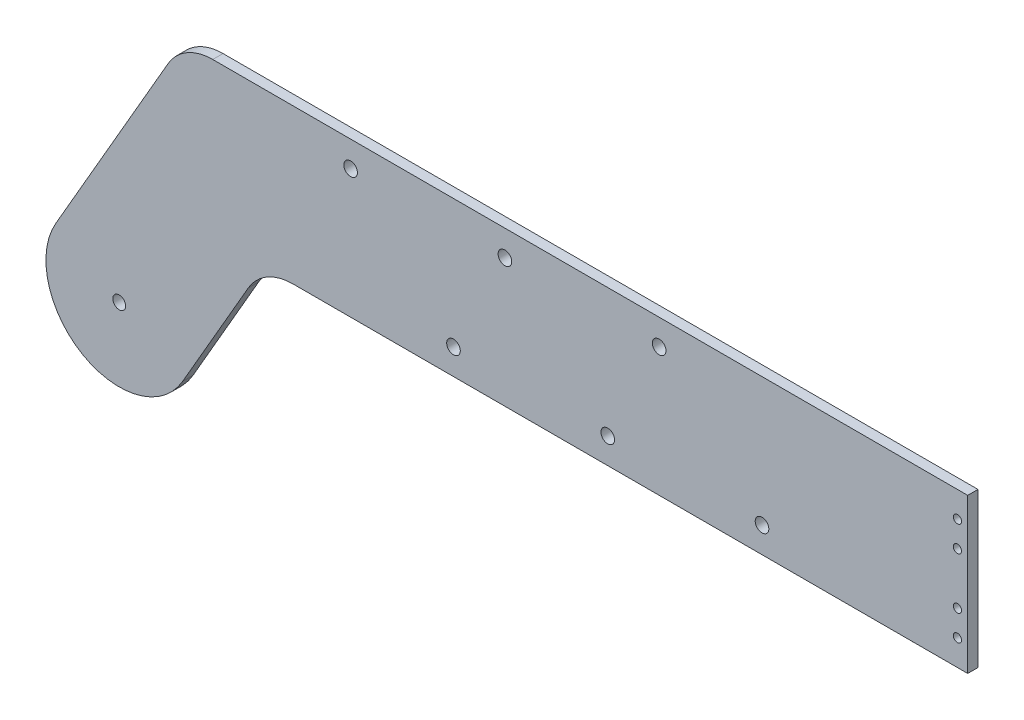
ISO-10303-21;
HEADER;
FILE_DESCRIPTION(('STEP AP214'),'2;1');
FILE_NAME('part.step','',(''),(''),'','','');
FILE_SCHEMA(('AUTOMOTIVE_DESIGN { 1 0 10303 214 1 1 1 1 }'));
ENDSEC;
DATA;
#1=APPLICATION_CONTEXT('core data for automotive mechanical design processes');
#2=APPLICATION_PROTOCOL_DEFINITION('international standard','automotive_design',2000,#1);
#3=PRODUCT_CONTEXT('',#1,'mechanical');
#4=PRODUCT('Part','Part','',(#3));
#5=PRODUCT_RELATED_PRODUCT_CATEGORY('part','',(#4));
#6=PRODUCT_DEFINITION_FORMATION('','',#4);
#7=PRODUCT_DEFINITION_CONTEXT('part definition',#1,'design');
#8=PRODUCT_DEFINITION('design','',#6,#7);
#9=PRODUCT_DEFINITION_SHAPE('','',#8);
#10=(LENGTH_UNIT() NAMED_UNIT(*) SI_UNIT(.MILLI.,.METRE.));
#11=(NAMED_UNIT(*) PLANE_ANGLE_UNIT() SI_UNIT($,.RADIAN.));
#12=(NAMED_UNIT(*) SI_UNIT($,.STERADIAN.) SOLID_ANGLE_UNIT());
#13=UNCERTAINTY_MEASURE_WITH_UNIT(LENGTH_MEASURE(1.E-05),#10,'distance_accuracy_value','');
#14=(GEOMETRIC_REPRESENTATION_CONTEXT(3) GLOBAL_UNCERTAINTY_ASSIGNED_CONTEXT((#13)) GLOBAL_UNIT_ASSIGNED_CONTEXT((#10,
#11,#12)) REPRESENTATION_CONTEXT('',''));
#15=CARTESIAN_POINT('',(0.,0.,0.));
#16=DIRECTION('',(0.,0.,1.));
#17=DIRECTION('',(1.,0.,0.));
#18=AXIS2_PLACEMENT_3D('',#15,#16,#17);
#19=CARTESIAN_POINT('',(150.75,35.75,4.));
#20=DIRECTION('',(0.,0.,1.));
#21=DIRECTION('',(1.,0.,0.));
#22=AXIS2_PLACEMENT_3D('',#19,#20,#21);
#23=PLANE('',#22);
#24=CARTESIAN_POINT('',(0.,0.,4.));
#25=DIRECTION('',(0.,0.,-1.));
#26=DIRECTION('',(1.,0.,0.));
#27=AXIS2_PLACEMENT_3D('',#24,#25,#26);
#28=CIRCLE('',#27,2.5);
#29=CARTESIAN_POINT('',(-2.5,0.,4.));
#30=VERTEX_POINT('',#29);
#31=EDGE_CURVE('E384',#30,#30,#28,.T.);
#32=ORIENTED_EDGE('',*,*,#31,.T.);
#33=EDGE_LOOP('',(#32));
#34=FACE_BOUND('',#33,.T.);
#35=CARTESIAN_POINT('',(326.,50.,4.));
#36=DIRECTION('',(0.,0.,-1.));
#37=DIRECTION('',(1.,0.,0.));
#38=AXIS2_PLACEMENT_3D('',#35,#36,#37);
#39=CIRCLE('',#38,1.6);
#40=CARTESIAN_POINT('',(324.4,50.,4.));
#41=VERTEX_POINT('',#40);
#42=EDGE_CURVE('E314',#41,#41,#39,.T.);
#43=ORIENTED_EDGE('',*,*,#42,.T.);
#44=EDGE_LOOP('',(#43));
#45=FACE_BOUND('',#44,.T.);
#46=CARTESIAN_POINT('',(326.,60.,4.));
#47=DIRECTION('',(0.,0.,-1.));
#48=DIRECTION('',(1.,0.,0.));
#49=AXIS2_PLACEMENT_3D('',#46,#47,#48);
#50=CIRCLE('',#49,1.6);
#51=CARTESIAN_POINT('',(324.4,60.,4.));
#52=VERTEX_POINT('',#51);
#53=EDGE_CURVE('E210',#52,#52,#50,.T.);
#54=ORIENTED_EDGE('',*,*,#53,.T.);
#55=EDGE_LOOP('',(#54));
#56=FACE_BOUND('',#55,.T.);
#57=CARTESIAN_POINT('',(326.,80.,4.));
#58=DIRECTION('',(0.,0.,-1.));
#59=DIRECTION('',(1.,0.,0.));
#60=AXIS2_PLACEMENT_3D('',#57,#58,#59);
#61=CIRCLE('',#60,1.6);
#62=CARTESIAN_POINT('',(324.4,80.,4.));
#63=VERTEX_POINT('',#62);
#64=EDGE_CURVE('E297',#63,#63,#61,.T.);
#65=ORIENTED_EDGE('',*,*,#64,.T.);
#66=EDGE_LOOP('',(#65));
#67=FACE_BOUND('',#66,.T.);
#68=CARTESIAN_POINT('',(326.,90.,4.));
#69=DIRECTION('',(0.,0.,-1.));
#70=DIRECTION('',(1.,0.,0.));
#71=AXIS2_PLACEMENT_3D('',#68,#69,#70);
#72=CIRCLE('',#71,1.6);
#73=CARTESIAN_POINT('',(324.4,90.,4.));
#74=VERTEX_POINT('',#73);
#75=EDGE_CURVE('E286',#74,#74,#72,.T.);
#76=ORIENTED_EDGE('',*,*,#75,.T.);
#77=EDGE_LOOP('',(#76));
#78=FACE_BOUND('',#77,.T.);
#79=CARTESIAN_POINT('',(210.,90.,4.));
#80=DIRECTION('',(0.,0.,-1.));
#81=DIRECTION('',(1.,0.,0.));
#82=AXIS2_PLACEMENT_3D('',#79,#80,#81);
#83=CIRCLE('',#82,2.65);
#84=CARTESIAN_POINT('',(207.35,90.,4.));
#85=VERTEX_POINT('',#84);
#86=EDGE_CURVE('E225',#85,#85,#83,.T.);
#87=ORIENTED_EDGE('',*,*,#86,.T.);
#88=EDGE_LOOP('',(#87));
#89=FACE_BOUND('',#88,.T.);
#90=CARTESIAN_POINT('',(250.,50.,4.));
#91=DIRECTION('',(0.,0.,-1.));
#92=DIRECTION('',(1.,0.,0.));
#93=AXIS2_PLACEMENT_3D('',#90,#91,#92);
#94=CIRCLE('',#93,2.65);
#95=CARTESIAN_POINT('',(247.35,50.,4.));
#96=VERTEX_POINT('',#95);
#97=EDGE_CURVE('E257',#96,#96,#94,.T.);
#98=ORIENTED_EDGE('',*,*,#97,.T.);
#99=EDGE_LOOP('',(#98));
#100=FACE_BOUND('',#99,.T.);
#101=CARTESIAN_POINT('',(150.,90.,4.));
#102=DIRECTION('',(0.,0.,-1.));
#103=DIRECTION('',(1.,0.,0.));
#104=AXIS2_PLACEMENT_3D('',#101,#102,#103);
#105=CIRCLE('',#104,2.65);
#106=CARTESIAN_POINT('',(147.35,90.,4.));
#107=VERTEX_POINT('',#106);
#108=EDGE_CURVE('E241',#107,#107,#105,.T.);
#109=ORIENTED_EDGE('',*,*,#108,.T.);
#110=EDGE_LOOP('',(#109));
#111=FACE_BOUND('',#110,.T.);
#112=CARTESIAN_POINT('',(190.,50.,4.));
#113=DIRECTION('',(0.,0.,-1.));
#114=DIRECTION('',(1.,0.,0.));
#115=AXIS2_PLACEMENT_3D('',#112,#113,#114);
#116=CIRCLE('',#115,2.65);
#117=CARTESIAN_POINT('',(187.35,50.,4.));
#118=VERTEX_POINT('',#117);
#119=EDGE_CURVE('E224',#118,#118,#116,.T.);
#120=ORIENTED_EDGE('',*,*,#119,.T.);
#121=EDGE_LOOP('',(#120));
#122=FACE_BOUND('',#121,.T.);
#123=CARTESIAN_POINT('',(90.,90.,4.));
#124=DIRECTION('',(0.,0.,-1.));
#125=DIRECTION('',(1.,0.,0.));
#126=AXIS2_PLACEMENT_3D('',#123,#124,#125);
#127=CIRCLE('',#126,2.65);
#128=CARTESIAN_POINT('',(87.35,90.,4.));
#129=VERTEX_POINT('',#128);
#130=EDGE_CURVE('E214',#129,#129,#127,.T.);
#131=ORIENTED_EDGE('',*,*,#130,.T.);
#132=EDGE_LOOP('',(#131));
#133=FACE_BOUND('',#132,.T.);
#134=CARTESIAN_POINT('',(130.,50.,4.));
#135=DIRECTION('',(0.,0.,-1.));
#136=DIRECTION('',(1.,0.,0.));
#137=AXIS2_PLACEMENT_3D('',#134,#135,#136);
#138=CIRCLE('',#137,2.65);
#139=CARTESIAN_POINT('',(127.35,50.,4.));
#140=VERTEX_POINT('',#139);
#141=EDGE_CURVE('E193',#140,#140,#138,.T.);
#142=ORIENTED_EDGE('',*,*,#141,.T.);
#143=EDGE_LOOP('',(#142));
#144=FACE_BOUND('',#143,.T.);
#145=CARTESIAN_POINT('',(36.3730669589464,80.,4.));
#146=DIRECTION('',(0.,0.,-1.));
#147=DIRECTION('',(-0.5,0.866025403784439,0.));
#148=AXIS2_PLACEMENT_3D('',#145,#146,#147);
#149=CIRCLE('',#148,20.);
#150=CARTESIAN_POINT('',(19.0525588832576,90.,4.));
#151=VERTEX_POINT('',#150);
#152=CARTESIAN_POINT('',(36.3730669589464,100.,4.));
#153=VERTEX_POINT('',#152);
#154=EDGE_CURVE('E269',#151,#153,#149,.T.);
#155=ORIENTED_EDGE('',*,*,#154,.F.);
#156=DIRECTION('',(-0.5,-0.866025403784439,0.));
#157=VECTOR('',#156,1.);
#158=CARTESIAN_POINT('',(24.8260615751539,100.,4.));
#159=LINE('',#158,#157);
#160=CARTESIAN_POINT('',(-24.6817240078565,14.25,4.));
#161=VERTEX_POINT('',#160);
#162=EDGE_CURVE('E25',#151,#161,#159,.T.);
#163=ORIENTED_EDGE('',*,*,#162,.T.);
#164=CARTESIAN_POINT('',(0.,0.,4.));
#165=DIRECTION('',(0.,0.,1.));
#166=DIRECTION('',(1.,0.,0.));
#167=AXIS2_PLACEMENT_3D('',#164,#165,#166);
#168=CIRCLE('',#167,28.5);
#169=CARTESIAN_POINT('',(24.6817240078565,-14.25,4.));
#170=VERTEX_POINT('',#169);
#171=EDGE_CURVE('E43',#161,#170,#168,.T.);
#172=ORIENTED_EDGE('',*,*,#171,.T.);
#173=DIRECTION('',(0.5,0.866025403784439,0.));
#174=VECTOR('',#173,1.);
#175=CARTESIAN_POINT('',(24.6817240078565,-14.25,4.));
#176=LINE('',#175,#174);
#177=CARTESIAN_POINT('',(50.2294734194974,30.,4.));
#178=VERTEX_POINT('',#177);
#179=EDGE_CURVE('E277',#170,#178,#176,.T.);
#180=ORIENTED_EDGE('',*,*,#179,.T.);
#181=CARTESIAN_POINT('',(67.5499814951862,20.,4.));
#182=DIRECTION('',(0.,0.,1.));
#183=DIRECTION('',(-0.5,0.866025403784438,0.));
#184=AXIS2_PLACEMENT_3D('',#181,#182,#183);
#185=CIRCLE('',#184,20.);
#186=CARTESIAN_POINT('',(67.5499814951862,40.,4.));
#187=VERTEX_POINT('',#186);
#188=EDGE_CURVE('E333',#187,#178,#185,.T.);
#189=ORIENTED_EDGE('',*,*,#188,.F.);
#190=DIRECTION('',(1.,0.,0.));
#191=VECTOR('',#190,1.);
#192=CARTESIAN_POINT('',(56.0029761113936,40.,4.));
#193=LINE('',#192,#191);
#194=CARTESIAN_POINT('',(330.,40.,4.));
#195=VERTEX_POINT('',#194);
#196=EDGE_CURVE('E265',#187,#195,#193,.T.);
#197=ORIENTED_EDGE('',*,*,#196,.T.);
#198=DIRECTION('',(0.,1.,0.));
#199=VECTOR('',#198,1.);
#200=CARTESIAN_POINT('',(330.,40.,4.));
#201=LINE('',#200,#199);
#202=CARTESIAN_POINT('',(330.,100.,4.));
#203=VERTEX_POINT('',#202);
#204=EDGE_CURVE('E11',#195,#203,#201,.T.);
#205=ORIENTED_EDGE('',*,*,#204,.T.);
#206=DIRECTION('',(-1.,0.,0.));
#207=VECTOR('',#206,1.);
#208=CARTESIAN_POINT('',(330.,100.,4.));
#209=LINE('',#208,#207);
#210=EDGE_CURVE('E362',#203,#153,#209,.T.);
#211=ORIENTED_EDGE('',*,*,#210,.T.);
#212=EDGE_LOOP('',(#155,#163,#172,#180,#189,#197,#205,#211));
#213=FACE_BOUND('',#212,.T.);
#214=ADVANCED_FACE('F17',(#34,#45,#56,#67,#78,#89,#100,#111,#122,#133,#144,#213),#23,.T.);
#215=CARTESIAN_POINT('',(330.,40.,0.));
#216=DIRECTION('',(1.,0.,0.));
#217=DIRECTION('',(0.,1.,0.));
#218=AXIS2_PLACEMENT_3D('',#215,#216,#217);
#219=PLANE('',#218);
#220=DIRECTION('',(0.,1.,0.));
#221=VECTOR('',#220,1.);
#222=CARTESIAN_POINT('',(330.,40.,0.));
#223=LINE('',#222,#221);
#224=CARTESIAN_POINT('',(330.,40.,0.));
#225=VERTEX_POINT('',#224);
#226=CARTESIAN_POINT('',(330.,100.,0.));
#227=VERTEX_POINT('',#226);
#228=EDGE_CURVE('E298',#225,#227,#223,.T.);
#229=ORIENTED_EDGE('',*,*,#228,.T.);
#230=DIRECTION('',(0.,0.,1.));
#231=VECTOR('',#230,1.);
#232=CARTESIAN_POINT('',(330.,100.,0.));
#233=LINE('',#232,#231);
#234=EDGE_CURVE('E380',#227,#203,#233,.T.);
#235=ORIENTED_EDGE('',*,*,#234,.T.);
#236=ORIENTED_EDGE('',*,*,#204,.F.);
#237=DIRECTION('',(0.,0.,1.));
#238=VECTOR('',#237,1.);
#239=CARTESIAN_POINT('',(330.,40.,0.));
#240=LINE('',#239,#238);
#241=EDGE_CURVE('E270',#225,#195,#240,.T.);
#242=ORIENTED_EDGE('',*,*,#241,.F.);
#243=EDGE_LOOP('',(#229,#235,#236,#242));
#244=FACE_BOUND('',#243,.T.);
#245=ADVANCED_FACE('F574',(#244),#219,.T.);
#246=CARTESIAN_POINT('',(24.8260615751539,100.,0.));
#247=DIRECTION('',(-0.866025403784439,0.5,0.));
#248=DIRECTION('',(0.,0.,1.));
#249=AXIS2_PLACEMENT_3D('',#246,#247,#248);
#250=PLANE('',#249);
#251=DIRECTION('',(0.,0.,1.));
#252=VECTOR('',#251,1.);
#253=CARTESIAN_POINT('',(19.0525588832576,90.,0.));
#254=LINE('',#253,#252);
#255=CARTESIAN_POINT('',(19.0525588832576,90.,0.));
#256=VERTEX_POINT('',#255);
#257=EDGE_CURVE('E278',#256,#151,#254,.T.);
#258=ORIENTED_EDGE('',*,*,#257,.F.);
#259=DIRECTION('',(-0.5,-0.866025403784439,0.));
#260=VECTOR('',#259,1.);
#261=CARTESIAN_POINT('',(24.8260615751539,100.,0.));
#262=LINE('',#261,#260);
#263=CARTESIAN_POINT('',(-24.6817240078565,14.25,0.));
#264=VERTEX_POINT('',#263);
#265=EDGE_CURVE('E363',#256,#264,#262,.T.);
#266=ORIENTED_EDGE('',*,*,#265,.T.);
#267=DIRECTION('',(0.,0.,1.));
#268=VECTOR('',#267,1.);
#269=CARTESIAN_POINT('',(-24.6817240078565,14.25,0.));
#270=LINE('',#269,#268);
#271=EDGE_CURVE('E218',#264,#161,#270,.T.);
#272=ORIENTED_EDGE('',*,*,#271,.T.);
#273=ORIENTED_EDGE('',*,*,#162,.F.);
#274=EDGE_LOOP('',(#258,#266,#272,#273));
#275=FACE_BOUND('',#274,.T.);
#276=ADVANCED_FACE('F581',(#275),#250,.T.);
#277=CARTESIAN_POINT('',(0.,0.,0.));
#278=DIRECTION('',(0.,0.,1.));
#279=DIRECTION('',(-0.5,-0.866025403784439,0.));
#280=AXIS2_PLACEMENT_3D('',#277,#278,#279);
#281=CYLINDRICAL_SURFACE('',#280,28.5);
#282=CARTESIAN_POINT('',(0.,0.,0.));
#283=DIRECTION('',(0.,0.,1.));
#284=DIRECTION('',(1.,0.,0.));
#285=AXIS2_PLACEMENT_3D('',#282,#283,#284);
#286=CIRCLE('',#285,28.5);
#287=CARTESIAN_POINT('',(24.6817240078565,-14.25,0.));
#288=VERTEX_POINT('',#287);
#289=EDGE_CURVE('E371',#264,#288,#286,.T.);
#290=ORIENTED_EDGE('',*,*,#289,.T.);
#291=DIRECTION('',(0.,0.,1.));
#292=VECTOR('',#291,1.);
#293=CARTESIAN_POINT('',(24.6817240078565,-14.25,0.));
#294=LINE('',#293,#292);
#295=EDGE_CURVE('E274',#288,#170,#294,.T.);
#296=ORIENTED_EDGE('',*,*,#295,.T.);
#297=ORIENTED_EDGE('',*,*,#171,.F.);
#298=ORIENTED_EDGE('',*,*,#271,.F.);
#299=EDGE_LOOP('',(#290,#296,#297,#298));
#300=FACE_BOUND('',#299,.T.);
#301=ADVANCED_FACE('F636',(#300),#281,.T.);
#302=CARTESIAN_POINT('',(24.6817240078565,-14.25,0.));
#303=DIRECTION('',(0.866025403784439,-0.5,0.));
#304=DIRECTION('',(0.,0.,-1.));
#305=AXIS2_PLACEMENT_3D('',#302,#303,#304);
#306=PLANE('',#305);
#307=DIRECTION('',(0.,0.,-1.));
#308=VECTOR('',#307,1.);
#309=CARTESIAN_POINT('',(50.2294734194974,30.,0.));
#310=LINE('',#309,#308);
#311=CARTESIAN_POINT('',(50.2294734194974,30.,0.));
#312=VERTEX_POINT('',#311);
#313=EDGE_CURVE('E337',#178,#312,#310,.T.);
#314=ORIENTED_EDGE('',*,*,#313,.F.);
#315=ORIENTED_EDGE('',*,*,#179,.F.);
#316=ORIENTED_EDGE('',*,*,#295,.F.);
#317=DIRECTION('',(0.5,0.866025403784439,0.));
#318=VECTOR('',#317,1.);
#319=CARTESIAN_POINT('',(24.6817240078565,-14.25,0.));
#320=LINE('',#319,#318);
#321=EDGE_CURVE('E302',#288,#312,#320,.T.);
#322=ORIENTED_EDGE('',*,*,#321,.T.);
#323=EDGE_LOOP('',(#314,#315,#316,#322));
#324=FACE_BOUND('',#323,.T.);
#325=ADVANCED_FACE('F634',(#324),#306,.T.);
#326=CARTESIAN_POINT('',(0.,0.,-376.854959269274));
#327=DIRECTION('',(0.,0.,1.));
#328=DIRECTION('',(1.,0.,0.));
#329=AXIS2_PLACEMENT_3D('',#326,#327,#328);
#330=CYLINDRICAL_SURFACE('',#329,2.5);
#331=ORIENTED_EDGE('',*,*,#31,.F.);
#332=DIRECTION('',(0.,0.,-1.));
#333=VECTOR('',#332,1.);
#334=CARTESIAN_POINT('',(-2.5,0.,-376.854959269274));
#335=LINE('',#334,#333);
#336=CARTESIAN_POINT('',(-2.5,0.,0.));
#337=VERTEX_POINT('',#336);
#338=EDGE_CURVE('E340',#30,#337,#335,.T.);
#339=ORIENTED_EDGE('',*,*,#338,.T.);
#340=CARTESIAN_POINT('',(0.,0.,0.));
#341=DIRECTION('',(0.,0.,1.));
#342=DIRECTION('',(1.,0.,0.));
#343=AXIS2_PLACEMENT_3D('',#340,#341,#342);
#344=CIRCLE('',#343,2.5);
#345=EDGE_CURVE('E358',#337,#337,#344,.T.);
#346=ORIENTED_EDGE('',*,*,#345,.F.);
#347=ORIENTED_EDGE('',*,*,#338,.F.);
#348=EDGE_LOOP('',(#331,#339,#346,#347));
#349=FACE_BOUND('',#348,.T.);
#350=ADVANCED_FACE('F647',(#349),#330,.F.);
#351=CARTESIAN_POINT('',(330.,100.,0.));
#352=DIRECTION('',(0.,1.,0.));
#353=DIRECTION('',(1.,0.,0.));
#354=AXIS2_PLACEMENT_3D('',#351,#352,#353);
#355=PLANE('',#354);
#356=DIRECTION('',(0.,0.,-1.));
#357=VECTOR('',#356,1.);
#358=CARTESIAN_POINT('',(36.3730669589464,100.,0.));
#359=LINE('',#358,#357);
#360=CARTESIAN_POINT('',(36.3730669589464,100.,0.));
#361=VERTEX_POINT('',#360);
#362=EDGE_CURVE('E354',#153,#361,#359,.T.);
#363=ORIENTED_EDGE('',*,*,#362,.F.);
#364=ORIENTED_EDGE('',*,*,#210,.F.);
#365=ORIENTED_EDGE('',*,*,#234,.F.);
#366=DIRECTION('',(-1.,0.,0.));
#367=VECTOR('',#366,1.);
#368=CARTESIAN_POINT('',(330.,100.,0.));
#369=LINE('',#368,#367);
#370=EDGE_CURVE('E282',#227,#361,#369,.T.);
#371=ORIENTED_EDGE('',*,*,#370,.T.);
#372=EDGE_LOOP('',(#363,#364,#365,#371));
#373=FACE_BOUND('',#372,.T.);
#374=ADVANCED_FACE('F609',(#373),#355,.T.);
#375=CARTESIAN_POINT('',(150.75,35.75,0.));
#376=DIRECTION('',(0.,0.,1.));
#377=DIRECTION('',(1.,0.,0.));
#378=AXIS2_PLACEMENT_3D('',#375,#376,#377);
#379=PLANE('',#378);
#380=ORIENTED_EDGE('',*,*,#345,.T.);
#381=EDGE_LOOP('',(#380));
#382=FACE_BOUND('',#381,.T.);
#383=CARTESIAN_POINT('',(326.,50.,0.));
#384=DIRECTION('',(0.,0.,1.));
#385=DIRECTION('',(1.,0.,0.));
#386=AXIS2_PLACEMENT_3D('',#383,#384,#385);
#387=CIRCLE('',#386,1.6);
#388=CARTESIAN_POINT('',(324.4,50.,0.));
#389=VERTEX_POINT('',#388);
#390=EDGE_CURVE('E322',#389,#389,#387,.T.);
#391=ORIENTED_EDGE('',*,*,#390,.T.);
#392=EDGE_LOOP('',(#391));
#393=FACE_BOUND('',#392,.T.);
#394=CARTESIAN_POINT('',(326.,60.,0.));
#395=DIRECTION('',(0.,0.,1.));
#396=DIRECTION('',(1.,0.,0.));
#397=AXIS2_PLACEMENT_3D('',#394,#395,#396);
#398=CIRCLE('',#397,1.6);
#399=CARTESIAN_POINT('',(324.4,60.,0.));
#400=VERTEX_POINT('',#399);
#401=EDGE_CURVE('E246',#400,#400,#398,.T.);
#402=ORIENTED_EDGE('',*,*,#401,.T.);
#403=EDGE_LOOP('',(#402));
#404=FACE_BOUND('',#403,.T.);
#405=CARTESIAN_POINT('',(326.,80.,0.));
#406=DIRECTION('',(0.,0.,1.));
#407=DIRECTION('',(1.,0.,0.));
#408=AXIS2_PLACEMENT_3D('',#405,#406,#407);
#409=CIRCLE('',#408,1.6);
#410=CARTESIAN_POINT('',(324.4,80.,0.));
#411=VERTEX_POINT('',#410);
#412=EDGE_CURVE('E207',#411,#411,#409,.T.);
#413=ORIENTED_EDGE('',*,*,#412,.T.);
#414=EDGE_LOOP('',(#413));
#415=FACE_BOUND('',#414,.T.);
#416=CARTESIAN_POINT('',(326.,90.,0.));
#417=DIRECTION('',(0.,0.,1.));
#418=DIRECTION('',(1.,0.,0.));
#419=AXIS2_PLACEMENT_3D('',#416,#417,#418);
#420=CIRCLE('',#419,1.6);
#421=CARTESIAN_POINT('',(324.4,90.,0.));
#422=VERTEX_POINT('',#421);
#423=EDGE_CURVE('E294',#422,#422,#420,.T.);
#424=ORIENTED_EDGE('',*,*,#423,.T.);
#425=EDGE_LOOP('',(#424));
#426=FACE_BOUND('',#425,.T.);
#427=CARTESIAN_POINT('',(210.,90.,0.));
#428=DIRECTION('',(0.,0.,1.));
#429=DIRECTION('',(1.,0.,0.));
#430=AXIS2_PLACEMENT_3D('',#427,#428,#429);
#431=CIRCLE('',#430,2.65);
#432=CARTESIAN_POINT('',(207.35,90.,0.));
#433=VERTEX_POINT('',#432);
#434=EDGE_CURVE('E261',#433,#433,#431,.T.);
#435=ORIENTED_EDGE('',*,*,#434,.T.);
#436=EDGE_LOOP('',(#435));
#437=FACE_BOUND('',#436,.T.);
#438=CARTESIAN_POINT('',(250.,50.,0.));
#439=DIRECTION('',(0.,0.,1.));
#440=DIRECTION('',(1.,0.,0.));
#441=AXIS2_PLACEMENT_3D('',#438,#439,#440);
#442=CIRCLE('',#441,2.65);
#443=CARTESIAN_POINT('',(247.35,50.,0.));
#444=VERTEX_POINT('',#443);
#445=EDGE_CURVE('E230',#444,#444,#442,.T.);
#446=ORIENTED_EDGE('',*,*,#445,.T.);
#447=EDGE_LOOP('',(#446));
#448=FACE_BOUND('',#447,.T.);
#449=CARTESIAN_POINT('',(150.,90.,0.));
#450=DIRECTION('',(0.,0.,1.));
#451=DIRECTION('',(1.,0.,0.));
#452=AXIS2_PLACEMENT_3D('',#449,#450,#451);
#453=CIRCLE('',#452,2.65);
#454=CARTESIAN_POINT('',(147.35,90.,0.));
#455=VERTEX_POINT('',#454);
#456=EDGE_CURVE('E254',#455,#455,#453,.T.);
#457=ORIENTED_EDGE('',*,*,#456,.T.);
#458=EDGE_LOOP('',(#457));
#459=FACE_BOUND('',#458,.T.);
#460=CARTESIAN_POINT('',(190.,50.,0.));
#461=DIRECTION('',(0.,0.,1.));
#462=DIRECTION('',(1.,0.,0.));
#463=AXIS2_PLACEMENT_3D('',#460,#461,#462);
#464=CIRCLE('',#463,2.65);
#465=CARTESIAN_POINT('',(187.35,50.,0.));
#466=VERTEX_POINT('',#465);
#467=EDGE_CURVE('E238',#466,#466,#464,.T.);
#468=ORIENTED_EDGE('',*,*,#467,.T.);
#469=EDGE_LOOP('',(#468));
#470=FACE_BOUND('',#469,.T.);
#471=CARTESIAN_POINT('',(90.,90.,0.));
#472=DIRECTION('',(0.,0.,1.));
#473=DIRECTION('',(1.,0.,0.));
#474=AXIS2_PLACEMENT_3D('',#471,#472,#473);
#475=CIRCLE('',#474,2.65);
#476=CARTESIAN_POINT('',(87.35,90.,0.));
#477=VERTEX_POINT('',#476);
#478=EDGE_CURVE('E221',#477,#477,#475,.T.);
#479=ORIENTED_EDGE('',*,*,#478,.T.);
#480=EDGE_LOOP('',(#479));
#481=FACE_BOUND('',#480,.T.);
#482=CARTESIAN_POINT('',(130.,50.,0.));
#483=DIRECTION('',(0.,0.,1.));
#484=DIRECTION('',(1.,0.,0.));
#485=AXIS2_PLACEMENT_3D('',#482,#483,#484);
#486=CIRCLE('',#485,2.65);
#487=CARTESIAN_POINT('',(127.35,50.,0.));
#488=VERTEX_POINT('',#487);
#489=EDGE_CURVE('E194',#488,#488,#486,.T.);
#490=ORIENTED_EDGE('',*,*,#489,.T.);
#491=EDGE_LOOP('',(#490));
#492=FACE_BOUND('',#491,.T.);
#493=CARTESIAN_POINT('',(36.3730669589464,80.,0.));
#494=DIRECTION('',(0.,0.,1.));
#495=DIRECTION('',(-0.5,0.866025403784439,0.));
#496=AXIS2_PLACEMENT_3D('',#493,#494,#495);
#497=CIRCLE('',#496,20.);
#498=EDGE_CURVE('E283',#361,#256,#497,.T.);
#499=ORIENTED_EDGE('',*,*,#498,.F.);
#500=ORIENTED_EDGE('',*,*,#370,.F.);
#501=ORIENTED_EDGE('',*,*,#228,.F.);
#502=DIRECTION('',(1.,0.,0.));
#503=VECTOR('',#502,1.);
#504=CARTESIAN_POINT('',(56.0029761113936,40.,0.));
#505=LINE('',#504,#503);
#506=CARTESIAN_POINT('',(67.5499814951862,40.,0.));
#507=VERTEX_POINT('',#506);
#508=EDGE_CURVE('E344',#507,#225,#505,.T.);
#509=ORIENTED_EDGE('',*,*,#508,.F.);
#510=CARTESIAN_POINT('',(67.5499814951862,20.,0.));
#511=DIRECTION('',(0.,0.,-1.));
#512=DIRECTION('',(-0.5,0.866025403784438,0.));
#513=AXIS2_PLACEMENT_3D('',#510,#511,#512);
#514=CIRCLE('',#513,20.);
#515=EDGE_CURVE('E325',#312,#507,#514,.T.);
#516=ORIENTED_EDGE('',*,*,#515,.F.);
#517=ORIENTED_EDGE('',*,*,#321,.F.);
#518=ORIENTED_EDGE('',*,*,#289,.F.);
#519=ORIENTED_EDGE('',*,*,#265,.F.);
#520=EDGE_LOOP('',(#499,#500,#501,#509,#516,#517,#518,#519));
#521=FACE_BOUND('',#520,.T.);
#522=ADVANCED_FACE('F605',(#382,#393,#404,#415,#426,#437,#448,#459,#470,#481,#492,#521),#379,.F.);
#523=CARTESIAN_POINT('',(36.3730669589464,80.,0.));
#524=DIRECTION('',(0.,0.,1.));
#525=DIRECTION('',(-0.5,0.866025403784439,0.));
#526=AXIS2_PLACEMENT_3D('',#523,#524,#525);
#527=CYLINDRICAL_SURFACE('',#526,20.);
#528=ORIENTED_EDGE('',*,*,#154,.T.);
#529=ORIENTED_EDGE('',*,*,#362,.T.);
#530=ORIENTED_EDGE('',*,*,#498,.T.);
#531=ORIENTED_EDGE('',*,*,#257,.T.);
#532=EDGE_LOOP('',(#528,#529,#530,#531));
#533=FACE_BOUND('',#532,.T.);
#534=ADVANCED_FACE('F608',(#533),#527,.T.);
#535=CARTESIAN_POINT('',(56.0029761113936,40.,0.));
#536=DIRECTION('',(0.,-1.,0.));
#537=DIRECTION('',(0.,0.,-1.));
#538=AXIS2_PLACEMENT_3D('',#535,#536,#537);
#539=PLANE('',#538);
#540=DIRECTION('',(0.,0.,1.));
#541=VECTOR('',#540,1.);
#542=CARTESIAN_POINT('',(67.5499814951862,40.,0.));
#543=LINE('',#542,#541);
#544=EDGE_CURVE('E329',#507,#187,#543,.T.);
#545=ORIENTED_EDGE('',*,*,#544,.F.);
#546=ORIENTED_EDGE('',*,*,#508,.T.);
#547=ORIENTED_EDGE('',*,*,#241,.T.);
#548=ORIENTED_EDGE('',*,*,#196,.F.);
#549=EDGE_LOOP('',(#545,#546,#547,#548));
#550=FACE_BOUND('',#549,.T.);
#551=ADVANCED_FACE('F627',(#550),#539,.T.);
#552=CARTESIAN_POINT('',(67.5499814951862,20.,0.));
#553=DIRECTION('',(0.,0.,1.));
#554=DIRECTION('',(-0.5,0.866025403784438,0.));
#555=AXIS2_PLACEMENT_3D('',#552,#553,#554);
#556=CYLINDRICAL_SURFACE('',#555,20.);
#557=ORIENTED_EDGE('',*,*,#515,.T.);
#558=ORIENTED_EDGE('',*,*,#544,.T.);
#559=ORIENTED_EDGE('',*,*,#188,.T.);
#560=ORIENTED_EDGE('',*,*,#313,.T.);
#561=EDGE_LOOP('',(#557,#558,#559,#560));
#562=FACE_BOUND('',#561,.T.);
#563=ADVANCED_FACE('F630',(#562),#556,.F.);
#564=CARTESIAN_POINT('',(326.,50.,-376.854959269274));
#565=DIRECTION('',(0.,0.,1.));
#566=DIRECTION('',(1.,0.,0.));
#567=AXIS2_PLACEMENT_3D('',#564,#565,#566);
#568=CYLINDRICAL_SURFACE('',#567,1.6);
#569=ORIENTED_EDGE('',*,*,#42,.F.);
#570=DIRECTION('',(0.,0.,-1.));
#571=VECTOR('',#570,1.);
#572=CARTESIAN_POINT('',(324.4,50.,-376.854959269274));
#573=LINE('',#572,#571);
#574=EDGE_CURVE('E318',#41,#389,#573,.T.);
#575=ORIENTED_EDGE('',*,*,#574,.T.);
#576=ORIENTED_EDGE('',*,*,#390,.F.);
#577=ORIENTED_EDGE('',*,*,#574,.F.);
#578=EDGE_LOOP('',(#569,#575,#576,#577));
#579=FACE_BOUND('',#578,.T.);
#580=ADVANCED_FACE('F657',(#579),#568,.F.);
#581=CARTESIAN_POINT('',(326.,60.,-376.854959269274));
#582=DIRECTION('',(0.,0.,1.));
#583=DIRECTION('',(1.,0.,0.));
#584=AXIS2_PLACEMENT_3D('',#581,#582,#583);
#585=CYLINDRICAL_SURFACE('',#584,1.6);
#586=ORIENTED_EDGE('',*,*,#53,.F.);
#587=DIRECTION('',(0.,0.,-1.));
#588=VECTOR('',#587,1.);
#589=CARTESIAN_POINT('',(324.4,60.,-376.854959269274));
#590=LINE('',#589,#588);
#591=EDGE_CURVE('E242',#52,#400,#590,.T.);
#592=ORIENTED_EDGE('',*,*,#591,.T.);
#593=ORIENTED_EDGE('',*,*,#401,.F.);
#594=ORIENTED_EDGE('',*,*,#591,.F.);
#595=EDGE_LOOP('',(#586,#592,#593,#594));
#596=FACE_BOUND('',#595,.T.);
#597=ADVANCED_FACE('F660',(#596),#585,.F.);
#598=CARTESIAN_POINT('',(326.,80.,-376.854959269274));
#599=DIRECTION('',(0.,0.,1.));
#600=DIRECTION('',(1.,0.,0.));
#601=AXIS2_PLACEMENT_3D('',#598,#599,#600);
#602=CYLINDRICAL_SURFACE('',#601,1.6);
#603=ORIENTED_EDGE('',*,*,#64,.F.);
#604=DIRECTION('',(0.,0.,-1.));
#605=VECTOR('',#604,1.);
#606=CARTESIAN_POINT('',(324.4,80.,-376.854959269274));
#607=LINE('',#606,#605);
#608=EDGE_CURVE('E211',#63,#411,#607,.T.);
#609=ORIENTED_EDGE('',*,*,#608,.T.);
#610=ORIENTED_EDGE('',*,*,#412,.F.);
#611=ORIENTED_EDGE('',*,*,#608,.F.);
#612=EDGE_LOOP('',(#603,#609,#610,#611));
#613=FACE_BOUND('',#612,.T.);
#614=ADVANCED_FACE('F664',(#613),#602,.F.);
#615=CARTESIAN_POINT('',(326.,90.,-376.854959269274));
#616=DIRECTION('',(0.,0.,1.));
#617=DIRECTION('',(1.,0.,0.));
#618=AXIS2_PLACEMENT_3D('',#615,#616,#617);
#619=CYLINDRICAL_SURFACE('',#618,1.6);
#620=ORIENTED_EDGE('',*,*,#75,.F.);
#621=DIRECTION('',(0.,0.,-1.));
#622=VECTOR('',#621,1.);
#623=CARTESIAN_POINT('',(324.4,90.,-376.854959269274));
#624=LINE('',#623,#622);
#625=EDGE_CURVE('E290',#74,#422,#624,.T.);
#626=ORIENTED_EDGE('',*,*,#625,.T.);
#627=ORIENTED_EDGE('',*,*,#423,.F.);
#628=ORIENTED_EDGE('',*,*,#625,.F.);
#629=EDGE_LOOP('',(#620,#626,#627,#628));
#630=FACE_BOUND('',#629,.T.);
#631=ADVANCED_FACE('F668',(#630),#619,.F.);
#632=CARTESIAN_POINT('',(210.,90.,-376.854959269274));
#633=DIRECTION('',(0.,0.,1.));
#634=DIRECTION('',(1.,0.,0.));
#635=AXIS2_PLACEMENT_3D('',#632,#633,#634);
#636=CYLINDRICAL_SURFACE('',#635,2.65);
#637=ORIENTED_EDGE('',*,*,#86,.F.);
#638=DIRECTION('',(0.,0.,-1.));
#639=VECTOR('',#638,1.);
#640=CARTESIAN_POINT('',(207.35,90.,-376.854959269274));
#641=LINE('',#640,#639);
#642=EDGE_CURVE('E229',#85,#433,#641,.T.);
#643=ORIENTED_EDGE('',*,*,#642,.T.);
#644=ORIENTED_EDGE('',*,*,#434,.F.);
#645=ORIENTED_EDGE('',*,*,#642,.F.);
#646=EDGE_LOOP('',(#637,#643,#644,#645));
#647=FACE_BOUND('',#646,.T.);
#648=ADVANCED_FACE('F673',(#647),#636,.F.);
#649=CARTESIAN_POINT('',(250.,50.,-376.854959269274));
#650=DIRECTION('',(0.,0.,1.));
#651=DIRECTION('',(1.,0.,0.));
#652=AXIS2_PLACEMENT_3D('',#649,#650,#651);
#653=CYLINDRICAL_SURFACE('',#652,2.65);
#654=ORIENTED_EDGE('',*,*,#97,.F.);
#655=DIRECTION('',(0.,0.,-1.));
#656=VECTOR('',#655,1.);
#657=CARTESIAN_POINT('',(247.35,50.,-376.854959269274));
#658=LINE('',#657,#656);
#659=EDGE_CURVE('E253',#96,#444,#658,.T.);
#660=ORIENTED_EDGE('',*,*,#659,.T.);
#661=ORIENTED_EDGE('',*,*,#445,.F.);
#662=ORIENTED_EDGE('',*,*,#659,.F.);
#663=EDGE_LOOP('',(#654,#660,#661,#662));
#664=FACE_BOUND('',#663,.T.);
#665=ADVANCED_FACE('F670',(#664),#653,.F.);
#666=CARTESIAN_POINT('',(150.,90.,-376.854959269274));
#667=DIRECTION('',(0.,0.,1.));
#668=DIRECTION('',(1.,0.,0.));
#669=AXIS2_PLACEMENT_3D('',#666,#667,#668);
#670=CYLINDRICAL_SURFACE('',#669,2.65);
#671=ORIENTED_EDGE('',*,*,#108,.F.);
#672=DIRECTION('',(0.,0.,-1.));
#673=VECTOR('',#672,1.);
#674=CARTESIAN_POINT('',(147.35,90.,-376.854959269274));
#675=LINE('',#674,#673);
#676=EDGE_CURVE('E250',#107,#455,#675,.T.);
#677=ORIENTED_EDGE('',*,*,#676,.T.);
#678=ORIENTED_EDGE('',*,*,#456,.F.);
#679=ORIENTED_EDGE('',*,*,#676,.F.);
#680=EDGE_LOOP('',(#671,#677,#678,#679));
#681=FACE_BOUND('',#680,.T.);
#682=ADVANCED_FACE('F672',(#681),#670,.F.);
#683=CARTESIAN_POINT('',(190.,50.,-376.854959269274));
#684=DIRECTION('',(0.,0.,1.));
#685=DIRECTION('',(1.,0.,0.));
#686=AXIS2_PLACEMENT_3D('',#683,#684,#685);
#687=CYLINDRICAL_SURFACE('',#686,2.65);
#688=ORIENTED_EDGE('',*,*,#119,.F.);
#689=DIRECTION('',(0.,0.,-1.));
#690=VECTOR('',#689,1.);
#691=CARTESIAN_POINT('',(187.35,50.,-376.854959269274));
#692=LINE('',#691,#690);
#693=EDGE_CURVE('E234',#118,#466,#692,.T.);
#694=ORIENTED_EDGE('',*,*,#693,.T.);
#695=ORIENTED_EDGE('',*,*,#467,.F.);
#696=ORIENTED_EDGE('',*,*,#693,.F.);
#697=EDGE_LOOP('',(#688,#694,#695,#696));
#698=FACE_BOUND('',#697,.T.);
#699=ADVANCED_FACE('F602',(#698),#687,.F.);
#700=CARTESIAN_POINT('',(90.,90.,-376.854959269274));
#701=DIRECTION('',(0.,0.,1.));
#702=DIRECTION('',(1.,0.,0.));
#703=AXIS2_PLACEMENT_3D('',#700,#701,#702);
#704=CYLINDRICAL_SURFACE('',#703,2.65);
#705=ORIENTED_EDGE('',*,*,#130,.F.);
#706=DIRECTION('',(0.,0.,-1.));
#707=VECTOR('',#706,1.);
#708=CARTESIAN_POINT('',(87.35,90.,-376.854959269274));
#709=LINE('',#708,#707);
#710=EDGE_CURVE('E204',#129,#477,#709,.T.);
#711=ORIENTED_EDGE('',*,*,#710,.T.);
#712=ORIENTED_EDGE('',*,*,#478,.F.);
#713=ORIENTED_EDGE('',*,*,#710,.F.);
#714=EDGE_LOOP('',(#705,#711,#712,#713));
#715=FACE_BOUND('',#714,.T.);
#716=ADVANCED_FACE('F571',(#715),#704,.F.);
#717=CARTESIAN_POINT('',(130.,50.,-376.854959269274));
#718=DIRECTION('',(0.,0.,1.));
#719=DIRECTION('',(1.,0.,0.));
#720=AXIS2_PLACEMENT_3D('',#717,#718,#719);
#721=CYLINDRICAL_SURFACE('',#720,2.65);
#722=ORIENTED_EDGE('',*,*,#141,.F.);
#723=DIRECTION('',(0.,0.,-1.));
#724=VECTOR('',#723,1.);
#725=CARTESIAN_POINT('',(127.35,50.,-376.854959269274));
#726=LINE('',#725,#724);
#727=EDGE_CURVE('E190',#140,#488,#726,.T.);
#728=ORIENTED_EDGE('',*,*,#727,.T.);
#729=ORIENTED_EDGE('',*,*,#489,.F.);
#730=ORIENTED_EDGE('',*,*,#727,.F.);
#731=EDGE_LOOP('',(#722,#728,#729,#730));
#732=FACE_BOUND('',#731,.T.);
#733=ADVANCED_FACE('F192',(#732),#721,.F.);
#734=CLOSED_SHELL('',(#214,#245,#276,#301,#325,#350,#374,#522,#534,#551,#563,#580,#597,#614,
#631,#648,#665,#682,#699,#716,#733));
#735=MANIFOLD_SOLID_BREP('B1',#734);
#736=ADVANCED_BREP_SHAPE_REPRESENTATION('',(#18,#735),#14);
#737=SHAPE_DEFINITION_REPRESENTATION(#9,#736);
ENDSEC;
END-ISO-10303-21;
